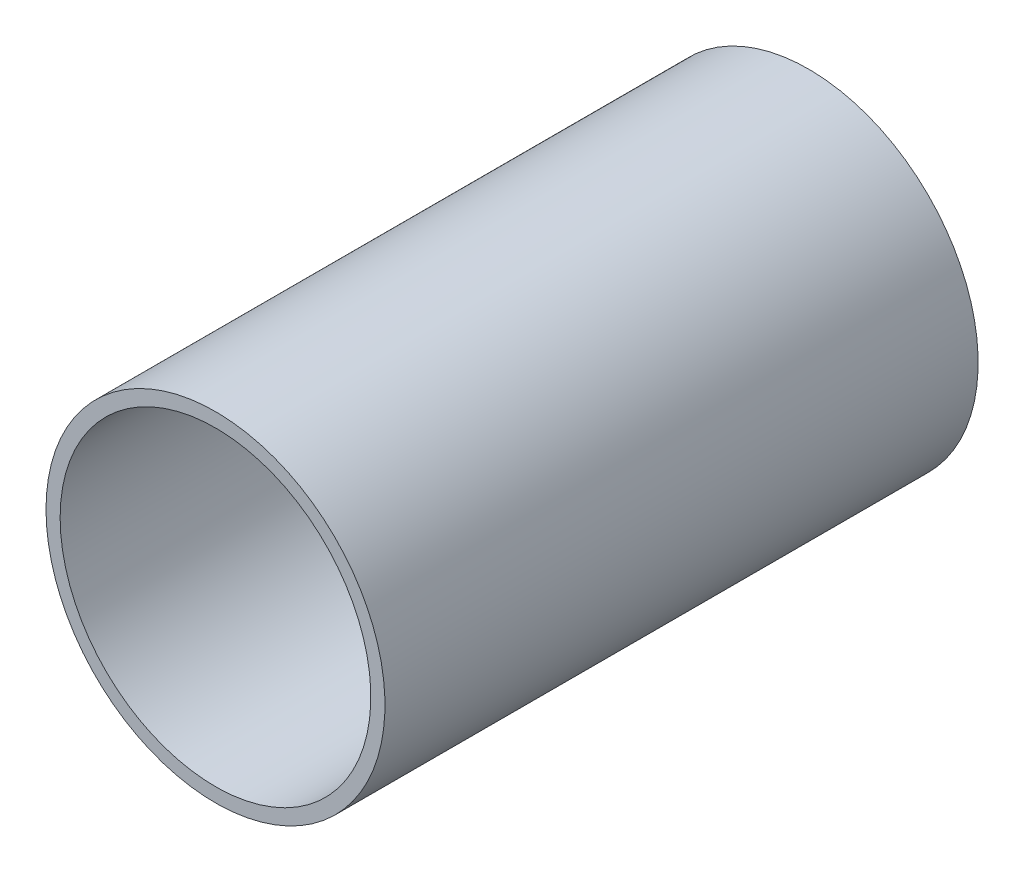
ISO-10303-21;
HEADER;
FILE_DESCRIPTION(('STEP AP214'),'2;1');
FILE_NAME('part.step','',(''),(''),'','','');
FILE_SCHEMA(('AUTOMOTIVE_DESIGN { 1 0 10303 214 1 1 1 1 }'));
ENDSEC;
DATA;
#1=APPLICATION_CONTEXT('core data for automotive mechanical design processes');
#2=APPLICATION_PROTOCOL_DEFINITION('international standard','automotive_design',2000,#1);
#3=PRODUCT_CONTEXT('',#1,'mechanical');
#4=PRODUCT('Part','Part','',(#3));
#5=PRODUCT_RELATED_PRODUCT_CATEGORY('part','',(#4));
#6=PRODUCT_DEFINITION_FORMATION('','',#4);
#7=PRODUCT_DEFINITION_CONTEXT('part definition',#1,'design');
#8=PRODUCT_DEFINITION('design','',#6,#7);
#9=PRODUCT_DEFINITION_SHAPE('','',#8);
#10=(LENGTH_UNIT() NAMED_UNIT(*) SI_UNIT(.MILLI.,.METRE.));
#11=(NAMED_UNIT(*) PLANE_ANGLE_UNIT() SI_UNIT($,.RADIAN.));
#12=(NAMED_UNIT(*) SI_UNIT($,.STERADIAN.) SOLID_ANGLE_UNIT());
#13=UNCERTAINTY_MEASURE_WITH_UNIT(LENGTH_MEASURE(1.E-05),#10,'distance_accuracy_value','');
#14=(GEOMETRIC_REPRESENTATION_CONTEXT(3) GLOBAL_UNCERTAINTY_ASSIGNED_CONTEXT((#13)) GLOBAL_UNIT_ASSIGNED_CONTEXT((#10,
#11,#12)) REPRESENTATION_CONTEXT('',''));
#15=CARTESIAN_POINT('',(0.,0.,0.));
#16=DIRECTION('',(0.,0.,1.));
#17=DIRECTION('',(1.,0.,0.));
#18=AXIS2_PLACEMENT_3D('',#15,#16,#17);
#19=CARTESIAN_POINT('',(0.,0.,42.));
#20=DIRECTION('',(0.,0.,1.));
#21=DIRECTION('',(1.,0.,0.));
#22=AXIS2_PLACEMENT_3D('',#19,#20,#21);
#23=PLANE('',#22);
#24=CARTESIAN_POINT('',(0.,0.,42.));
#25=DIRECTION('',(0.,0.,1.));
#26=DIRECTION('',(1.,0.,0.));
#27=AXIS2_PLACEMENT_3D('',#24,#25,#26);
#28=CIRCLE('',#27,12.);
#29=CARTESIAN_POINT('',(-12.,0.,42.));
#30=VERTEX_POINT('',#29);
#31=EDGE_CURVE('E10',#30,#30,#28,.T.);
#32=ORIENTED_EDGE('',*,*,#31,.T.);
#33=EDGE_LOOP('',(#32));
#34=FACE_BOUND('',#33,.T.);
#35=CARTESIAN_POINT('',(0.,0.,42.));
#36=DIRECTION('',(0.,0.,1.));
#37=DIRECTION('',(1.,0.,0.));
#38=AXIS2_PLACEMENT_3D('',#35,#36,#37);
#39=CIRCLE('',#38,11.);
#40=CARTESIAN_POINT('',(-11.,0.,42.));
#41=VERTEX_POINT('',#40);
#42=EDGE_CURVE('E50',#41,#41,#39,.T.);
#43=ORIENTED_EDGE('',*,*,#42,.F.);
#44=EDGE_LOOP('',(#43));
#45=FACE_BOUND('',#44,.T.);
#46=ADVANCED_FACE('F37',(#34,#45),#23,.T.);
#47=CARTESIAN_POINT('',(0.,0.,0.));
#48=DIRECTION('',(0.,0.,1.));
#49=DIRECTION('',(1.,0.,0.));
#50=AXIS2_PLACEMENT_3D('',#47,#48,#49);
#51=PLANE('',#50);
#52=CARTESIAN_POINT('',(0.,0.,0.));
#53=DIRECTION('',(0.,0.,1.));
#54=DIRECTION('',(1.,0.,0.));
#55=AXIS2_PLACEMENT_3D('',#52,#53,#54);
#56=CIRCLE('',#55,12.);
#57=CARTESIAN_POINT('',(-12.,0.,0.));
#58=VERTEX_POINT('',#57);
#59=EDGE_CURVE('E41',#58,#58,#56,.T.);
#60=ORIENTED_EDGE('',*,*,#59,.F.);
#61=EDGE_LOOP('',(#60));
#62=FACE_BOUND('',#61,.T.);
#63=CARTESIAN_POINT('',(0.,0.,0.));
#64=DIRECTION('',(0.,0.,1.));
#65=DIRECTION('',(1.,0.,0.));
#66=AXIS2_PLACEMENT_3D('',#63,#64,#65);
#67=CIRCLE('',#66,11.);
#68=CARTESIAN_POINT('',(-11.,0.,0.));
#69=VERTEX_POINT('',#68);
#70=EDGE_CURVE('E52',#69,#69,#67,.T.);
#71=ORIENTED_EDGE('',*,*,#70,.T.);
#72=EDGE_LOOP('',(#71));
#73=FACE_BOUND('',#72,.T.);
#74=ADVANCED_FACE('F64',(#62,#73),#51,.F.);
#75=CARTESIAN_POINT('',(0.,0.,42.));
#76=DIRECTION('',(0.,0.,-1.));
#77=DIRECTION('',(-1.,0.,0.));
#78=AXIS2_PLACEMENT_3D('',#75,#76,#77);
#79=CYLINDRICAL_SURFACE('',#78,12.);
#80=CARTESIAN_POINT('',(-12.,0.,42.));
#81=CARTESIAN_POINT('',(-12.,0.,41.5625));
#82=CARTESIAN_POINT('',(-12.,0.,41.125));
#83=CARTESIAN_POINT('',(-12.,0.,40.25));
#84=CARTESIAN_POINT('',(-12.,0.,39.8125));
#85=CARTESIAN_POINT('',(-12.,0.,38.9375));
#86=CARTESIAN_POINT('',(-12.,0.,38.5));
#87=CARTESIAN_POINT('',(-12.,0.,37.625));
#88=CARTESIAN_POINT('',(-12.,0.,37.1875));
#89=CARTESIAN_POINT('',(-12.,0.,36.3125));
#90=CARTESIAN_POINT('',(-12.,0.,35.875));
#91=CARTESIAN_POINT('',(-12.,0.,35.));
#92=CARTESIAN_POINT('',(-12.,0.,34.5625));
#93=CARTESIAN_POINT('',(-12.,0.,33.6875));
#94=CARTESIAN_POINT('',(-12.,0.,33.25));
#95=CARTESIAN_POINT('',(-12.,0.,32.375));
#96=CARTESIAN_POINT('',(-12.,0.,31.9375));
#97=CARTESIAN_POINT('',(-12.,0.,31.0625));
#98=CARTESIAN_POINT('',(-12.,0.,30.625));
#99=CARTESIAN_POINT('',(-12.,0.,29.75));
#100=CARTESIAN_POINT('',(-12.,0.,29.3125));
#101=CARTESIAN_POINT('',(-12.,0.,28.4375));
#102=CARTESIAN_POINT('',(-12.,0.,28.));
#103=CARTESIAN_POINT('',(-12.,0.,27.125));
#104=CARTESIAN_POINT('',(-12.,0.,26.6875));
#105=CARTESIAN_POINT('',(-12.,0.,25.8125));
#106=CARTESIAN_POINT('',(-12.,0.,25.375));
#107=CARTESIAN_POINT('',(-12.,0.,24.5));
#108=CARTESIAN_POINT('',(-12.,0.,24.0625));
#109=CARTESIAN_POINT('',(-12.,0.,23.1875));
#110=CARTESIAN_POINT('',(-12.,0.,22.75));
#111=CARTESIAN_POINT('',(-12.,0.,21.875));
#112=CARTESIAN_POINT('',(-12.,0.,21.4375));
#113=CARTESIAN_POINT('',(-12.,0.,20.5625));
#114=CARTESIAN_POINT('',(-12.,0.,20.125));
#115=CARTESIAN_POINT('',(-12.,0.,19.25));
#116=CARTESIAN_POINT('',(-12.,0.,18.8125));
#117=CARTESIAN_POINT('',(-12.,0.,17.9375));
#118=CARTESIAN_POINT('',(-12.,0.,17.5));
#119=CARTESIAN_POINT('',(-12.,0.,16.625));
#120=CARTESIAN_POINT('',(-12.,0.,16.1875));
#121=CARTESIAN_POINT('',(-12.,0.,15.3125));
#122=CARTESIAN_POINT('',(-12.,0.,14.875));
#123=CARTESIAN_POINT('',(-12.,0.,14.));
#124=CARTESIAN_POINT('',(-12.,0.,13.5625));
#125=CARTESIAN_POINT('',(-12.,0.,12.6875));
#126=CARTESIAN_POINT('',(-12.,0.,12.25));
#127=CARTESIAN_POINT('',(-12.,0.,11.375));
#128=CARTESIAN_POINT('',(-12.,0.,10.9375));
#129=CARTESIAN_POINT('',(-12.,0.,10.0625));
#130=CARTESIAN_POINT('',(-12.,0.,9.625));
#131=CARTESIAN_POINT('',(-12.,0.,8.75));
#132=CARTESIAN_POINT('',(-12.,0.,8.3125));
#133=CARTESIAN_POINT('',(-12.,0.,7.4375));
#134=CARTESIAN_POINT('',(-12.,0.,7.));
#135=CARTESIAN_POINT('',(-12.,0.,6.125));
#136=CARTESIAN_POINT('',(-12.,0.,5.6875));
#137=CARTESIAN_POINT('',(-12.,0.,4.8125));
#138=CARTESIAN_POINT('',(-12.,0.,4.375));
#139=CARTESIAN_POINT('',(-12.,0.,3.5));
#140=CARTESIAN_POINT('',(-12.,0.,3.0625));
#141=CARTESIAN_POINT('',(-12.,0.,2.1875));
#142=CARTESIAN_POINT('',(-12.,0.,1.75));
#143=CARTESIAN_POINT('',(-12.,0.,0.875000000000001));
#144=CARTESIAN_POINT('',(-12.,0.,0.4375));
#145=CARTESIAN_POINT('',(-12.,0.,0.));
#146=B_SPLINE_CURVE_WITH_KNOTS('',3,(#80,#81,#82,#83,#84,#85,#86,#87,#88,#89,#90,#91,#92,#93,
#94,#95,#96,#97,#98,#99,#100,#101,#102,#103,#104,#105,#106,#107,#108,#109,#110,#111,#112,#113,
#114,#115,#116,#117,#118,#119,#120,#121,#122,#123,#124,#125,#126,#127,#128,#129,#130,#131,#132,
#133,#134,#135,#136,#137,#138,#139,#140,#141,#142,#143,#144,#145),.UNSPECIFIED.,.F.,.F.,(4,2,2,
2,2,2,2,2,2,2,2,2,2,2,2,2,2,2,2,2,2,2,2,2,2,2,2,2,2,2,2,2,4),(0.,1.31249999999999,2.625,3.9375,
5.25,6.5625,7.87499999999999,9.18749999999999,10.5,11.8125,13.125,14.4375,15.75,17.0625,18.375,
19.6875,21.,22.3125,23.625,24.9375,26.25,27.5625,28.875,30.1875,31.5,32.8125,34.125,35.4375,
36.75,38.0625,39.375,40.6875,42.),.UNSPECIFIED.);
#147=EDGE_CURVE('BSEAM39',#30,#58,#146,.T.);
#148=ORIENTED_EDGE('',*,*,#31,.F.);
#149=ORIENTED_EDGE('',*,*,#59,.T.);
#150=ORIENTED_EDGE('',*,*,#147,.T.);
#151=ORIENTED_EDGE('',*,*,#147,.F.);
#152=EDGE_LOOP('',(#148,#150,#149,#151));
#153=FACE_BOUND('',#152,.T.);
#154=ADVANCED_FACE('F39',(#153),#79,.T.);
#155=CARTESIAN_POINT('',(0.,0.,42.));
#156=DIRECTION('',(0.,0.,-1.));
#157=DIRECTION('',(-1.,0.,0.));
#158=AXIS2_PLACEMENT_3D('',#155,#156,#157);
#159=CYLINDRICAL_SURFACE('',#158,11.);
#160=CARTESIAN_POINT('',(-11.,0.,42.));
#161=CARTESIAN_POINT('',(-11.,0.,41.5625));
#162=CARTESIAN_POINT('',(-11.,0.,41.125));
#163=CARTESIAN_POINT('',(-11.,0.,40.25));
#164=CARTESIAN_POINT('',(-11.,0.,39.8125));
#165=CARTESIAN_POINT('',(-11.,0.,38.9375));
#166=CARTESIAN_POINT('',(-11.,0.,38.5));
#167=CARTESIAN_POINT('',(-11.,0.,37.625));
#168=CARTESIAN_POINT('',(-11.,0.,37.1875));
#169=CARTESIAN_POINT('',(-11.,0.,36.3125));
#170=CARTESIAN_POINT('',(-11.,0.,35.875));
#171=CARTESIAN_POINT('',(-11.,0.,35.));
#172=CARTESIAN_POINT('',(-11.,0.,34.5625));
#173=CARTESIAN_POINT('',(-11.,0.,33.6875));
#174=CARTESIAN_POINT('',(-11.,0.,33.25));
#175=CARTESIAN_POINT('',(-11.,0.,32.375));
#176=CARTESIAN_POINT('',(-11.,0.,31.9375));
#177=CARTESIAN_POINT('',(-11.,0.,31.0625));
#178=CARTESIAN_POINT('',(-11.,0.,30.625));
#179=CARTESIAN_POINT('',(-11.,0.,29.75));
#180=CARTESIAN_POINT('',(-11.,0.,29.3125));
#181=CARTESIAN_POINT('',(-11.,0.,28.4375));
#182=CARTESIAN_POINT('',(-11.,0.,28.));
#183=CARTESIAN_POINT('',(-11.,0.,27.125));
#184=CARTESIAN_POINT('',(-11.,0.,26.6875));
#185=CARTESIAN_POINT('',(-11.,0.,25.8125));
#186=CARTESIAN_POINT('',(-11.,0.,25.375));
#187=CARTESIAN_POINT('',(-11.,0.,24.5));
#188=CARTESIAN_POINT('',(-11.,0.,24.0625));
#189=CARTESIAN_POINT('',(-11.,0.,23.1875));
#190=CARTESIAN_POINT('',(-11.,0.,22.75));
#191=CARTESIAN_POINT('',(-11.,0.,21.875));
#192=CARTESIAN_POINT('',(-11.,0.,21.4375));
#193=CARTESIAN_POINT('',(-11.,0.,20.5625));
#194=CARTESIAN_POINT('',(-11.,0.,20.125));
#195=CARTESIAN_POINT('',(-11.,0.,19.25));
#196=CARTESIAN_POINT('',(-11.,0.,18.8125));
#197=CARTESIAN_POINT('',(-11.,0.,17.9375));
#198=CARTESIAN_POINT('',(-11.,0.,17.5));
#199=CARTESIAN_POINT('',(-11.,0.,16.625));
#200=CARTESIAN_POINT('',(-11.,0.,16.1875));
#201=CARTESIAN_POINT('',(-11.,0.,15.3125));
#202=CARTESIAN_POINT('',(-11.,0.,14.875));
#203=CARTESIAN_POINT('',(-11.,0.,14.));
#204=CARTESIAN_POINT('',(-11.,0.,13.5625));
#205=CARTESIAN_POINT('',(-11.,0.,12.6875));
#206=CARTESIAN_POINT('',(-11.,0.,12.25));
#207=CARTESIAN_POINT('',(-11.,0.,11.375));
#208=CARTESIAN_POINT('',(-11.,0.,10.9375));
#209=CARTESIAN_POINT('',(-11.,0.,10.0625));
#210=CARTESIAN_POINT('',(-11.,0.,9.625));
#211=CARTESIAN_POINT('',(-11.,0.,8.75));
#212=CARTESIAN_POINT('',(-11.,0.,8.3125));
#213=CARTESIAN_POINT('',(-11.,0.,7.4375));
#214=CARTESIAN_POINT('',(-11.,0.,7.));
#215=CARTESIAN_POINT('',(-11.,0.,6.125));
#216=CARTESIAN_POINT('',(-11.,0.,5.6875));
#217=CARTESIAN_POINT('',(-11.,0.,4.8125));
#218=CARTESIAN_POINT('',(-11.,0.,4.375));
#219=CARTESIAN_POINT('',(-11.,0.,3.5));
#220=CARTESIAN_POINT('',(-11.,0.,3.0625));
#221=CARTESIAN_POINT('',(-11.,0.,2.1875));
#222=CARTESIAN_POINT('',(-11.,0.,1.75));
#223=CARTESIAN_POINT('',(-11.,0.,0.875000000000001));
#224=CARTESIAN_POINT('',(-11.,0.,0.4375));
#225=CARTESIAN_POINT('',(-11.,0.,0.));
#226=B_SPLINE_CURVE_WITH_KNOTS('',3,(#160,#161,#162,#163,#164,#165,#166,#167,#168,#169,#170,
#171,#172,#173,#174,#175,#176,#177,#178,#179,#180,#181,#182,#183,#184,#185,#186,#187,#188,#189,
#190,#191,#192,#193,#194,#195,#196,#197,#198,#199,#200,#201,#202,#203,#204,#205,#206,#207,#208,
#209,#210,#211,#212,#213,#214,#215,#216,#217,#218,#219,#220,#221,#222,#223,#224,#225),
.UNSPECIFIED.,.F.,.F.,(4,2,2,2,2,2,2,2,2,2,2,2,2,2,2,2,2,2,2,2,2,2,2,2,2,2,2,2,2,2,2,2,4),(0.,
1.3125,2.625,3.9375,5.25,6.56250000000001,7.875,9.1875,10.5,11.8125,13.125,14.4375,15.75,
17.0625,18.375,19.6875,21.,22.3125,23.625,24.9375,26.25,27.5625,28.875,30.1875,31.5,32.8125,
34.125,35.4375,36.75,38.0625,39.375,40.6875,42.),.UNSPECIFIED.);
#227=EDGE_CURVE('BSEAM60',#41,#69,#226,.T.);
#228=ORIENTED_EDGE('',*,*,#42,.T.);
#229=ORIENTED_EDGE('',*,*,#70,.F.);
#230=ORIENTED_EDGE('',*,*,#227,.T.);
#231=ORIENTED_EDGE('',*,*,#227,.F.);
#232=EDGE_LOOP('',(#228,#230,#229,#231));
#233=FACE_BOUND('',#232,.T.);
#234=ADVANCED_FACE('F60',(#233),#159,.F.);
#235=CLOSED_SHELL('',(#46,#74,#154,#234));
#236=MANIFOLD_SOLID_BREP('B2',#235);
#237=ADVANCED_BREP_SHAPE_REPRESENTATION('',(#18,#236),#14);
#238=SHAPE_DEFINITION_REPRESENTATION(#9,#237);
ENDSEC;
END-ISO-10303-21;
